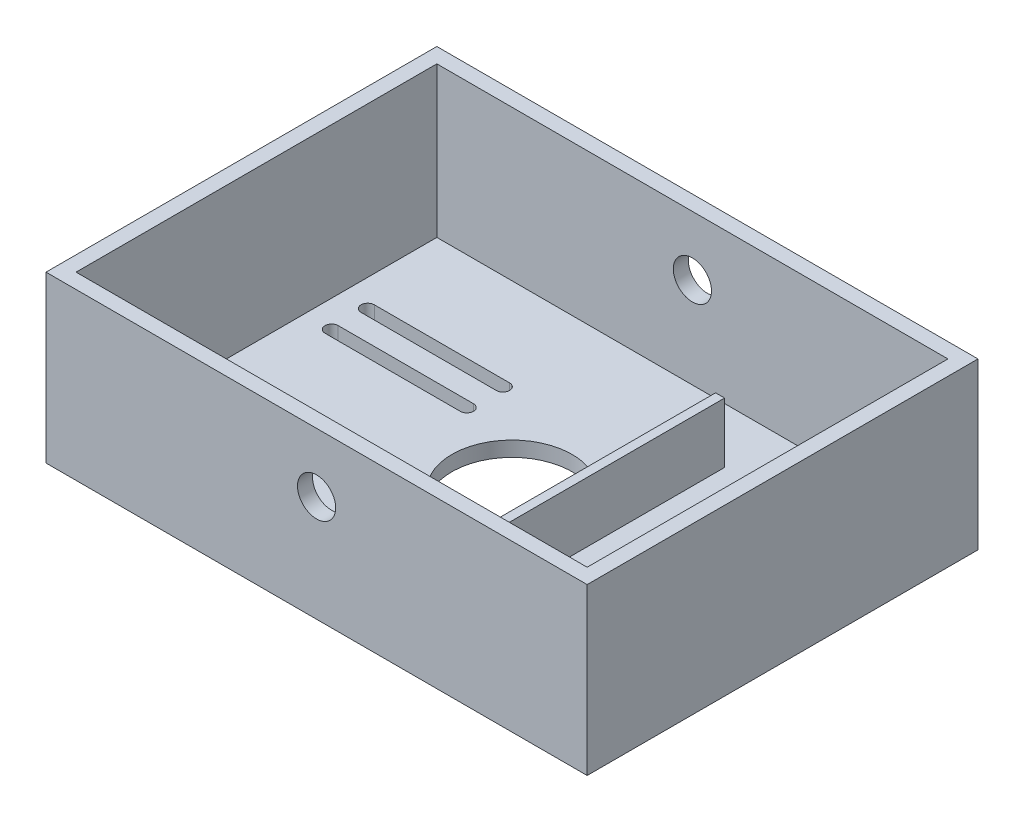
ISO-10303-21;
HEADER;
FILE_DESCRIPTION(('STEP AP214'),'2;1');
FILE_NAME('part.step','',(''),(''),'','','');
FILE_SCHEMA(('AUTOMOTIVE_DESIGN { 1 0 10303 214 1 1 1 1 }'));
ENDSEC;
DATA;
#1=APPLICATION_CONTEXT('core data for automotive mechanical design processes');
#2=APPLICATION_PROTOCOL_DEFINITION('international standard','automotive_design',2000,#1);
#3=PRODUCT_CONTEXT('',#1,'mechanical');
#4=PRODUCT('Part','Part','',(#3));
#5=PRODUCT_RELATED_PRODUCT_CATEGORY('part','',(#4));
#6=PRODUCT_DEFINITION_FORMATION('','',#4);
#7=PRODUCT_DEFINITION_CONTEXT('part definition',#1,'design');
#8=PRODUCT_DEFINITION('design','',#6,#7);
#9=PRODUCT_DEFINITION_SHAPE('','',#8);
#10=(LENGTH_UNIT() NAMED_UNIT(*) SI_UNIT(.MILLI.,.METRE.));
#11=(NAMED_UNIT(*) PLANE_ANGLE_UNIT() SI_UNIT($,.RADIAN.));
#12=(NAMED_UNIT(*) SI_UNIT($,.STERADIAN.) SOLID_ANGLE_UNIT());
#13=UNCERTAINTY_MEASURE_WITH_UNIT(LENGTH_MEASURE(1.E-05),#10,'distance_accuracy_value','');
#14=(GEOMETRIC_REPRESENTATION_CONTEXT(3) GLOBAL_UNCERTAINTY_ASSIGNED_CONTEXT((#13)) GLOBAL_UNIT_ASSIGNED_CONTEXT((#10,
#11,#12)) REPRESENTATION_CONTEXT('',''));
#15=CARTESIAN_POINT('',(0.,0.,0.));
#16=DIRECTION('',(0.,0.,1.));
#17=DIRECTION('',(1.,0.,0.));
#18=AXIS2_PLACEMENT_3D('',#15,#16,#17);
#19=CARTESIAN_POINT('',(85.,55.,60.));
#20=DIRECTION('',(0.,0.,-1.));
#21=DIRECTION('',(-1.,0.,0.));
#22=AXIS2_PLACEMENT_3D('',#19,#20,#21);
#23=PLANE('',#22);
#24=CARTESIAN_POINT('',(0.,35.25,60.));
#25=DIRECTION('',(0.,0.,-1.));
#26=DIRECTION('',(-1.,0.,0.));
#27=AXIS2_PLACEMENT_3D('',#24,#25,#26);
#28=CIRCLE('',#27,6.35);
#29=CARTESIAN_POINT('',(-6.35000000000001,35.25,60.));
#30=VERTEX_POINT('',#29);
#31=EDGE_CURVE('E233',#30,#30,#28,.T.);
#32=ORIENTED_EDGE('',*,*,#31,.F.);
#33=EDGE_LOOP('',(#32));
#34=FACE_BOUND('',#33,.T.);
#35=DIRECTION('',(1.,0.,0.));
#36=VECTOR('',#35,1.);
#37=CARTESIAN_POINT('',(26.12,25.,60.));
#38=LINE('',#37,#36);
#39=CARTESIAN_POINT('',(26.12,25.,60.));
#40=VERTEX_POINT('',#39);
#41=CARTESIAN_POINT('',(29.12,25.,60.));
#42=VERTEX_POINT('',#41);
#43=EDGE_CURVE('E182',#40,#42,#38,.T.);
#44=ORIENTED_EDGE('',*,*,#43,.F.);
#45=DIRECTION('',(0.,-1.,0.));
#46=VECTOR('',#45,1.);
#47=CARTESIAN_POINT('',(26.12,25.,60.));
#48=LINE('',#47,#46);
#49=CARTESIAN_POINT('',(26.12,5.,60.));
#50=VERTEX_POINT('',#49);
#51=EDGE_CURVE('E192',#40,#50,#48,.T.);
#52=ORIENTED_EDGE('',*,*,#51,.T.);
#53=DIRECTION('',(1.,0.,0.));
#54=VECTOR('',#53,1.);
#55=CARTESIAN_POINT('',(-85.,5.,60.));
#56=LINE('',#55,#54);
#57=CARTESIAN_POINT('',(-85.,5.,60.));
#58=VERTEX_POINT('',#57);
#59=EDGE_CURVE('E336',#58,#50,#56,.T.);
#60=ORIENTED_EDGE('',*,*,#59,.F.);
#61=DIRECTION('',(0.,-1.,0.));
#62=VECTOR('',#61,1.);
#63=CARTESIAN_POINT('',(-85.,55.,60.));
#64=LINE('',#63,#62);
#65=CARTESIAN_POINT('',(-85.,55.,60.));
#66=VERTEX_POINT('',#65);
#67=EDGE_CURVE('E371',#66,#58,#64,.T.);
#68=ORIENTED_EDGE('',*,*,#67,.F.);
#69=DIRECTION('',(1.,0.,0.));
#70=VECTOR('',#69,1.);
#71=CARTESIAN_POINT('',(85.,55.,60.));
#72=LINE('',#71,#70);
#73=CARTESIAN_POINT('',(85.,55.,60.));
#74=VERTEX_POINT('',#73);
#75=EDGE_CURVE('E350',#66,#74,#72,.T.);
#76=ORIENTED_EDGE('',*,*,#75,.T.);
#77=DIRECTION('',(0.,-1.,0.));
#78=VECTOR('',#77,1.);
#79=CARTESIAN_POINT('',(85.,55.,60.));
#80=LINE('',#79,#78);
#81=CARTESIAN_POINT('',(85.,5.,60.));
#82=VERTEX_POINT('',#81);
#83=EDGE_CURVE('E367',#74,#82,#80,.T.);
#84=ORIENTED_EDGE('',*,*,#83,.T.);
#85=CARTESIAN_POINT('',(29.12,5.,60.));
#86=VERTEX_POINT('',#85);
#87=EDGE_CURVE('E335',#86,#82,#56,.T.);
#88=ORIENTED_EDGE('',*,*,#87,.F.);
#89=DIRECTION('',(0.,-1.,0.));
#90=VECTOR('',#89,1.);
#91=CARTESIAN_POINT('',(29.12,25.,60.));
#92=LINE('',#91,#90);
#93=EDGE_CURVE('E200',#42,#86,#92,.T.);
#94=ORIENTED_EDGE('',*,*,#93,.F.);
#95=EDGE_LOOP('',(#44,#52,#60,#68,#76,#84,#88,#94));
#96=FACE_BOUND('',#95,.T.);
#97=ADVANCED_FACE('F39',(#34,#96),#23,.T.);
#98=CARTESIAN_POINT('',(0.,5.,0.));
#99=DIRECTION('',(0.,1.,0.));
#100=DIRECTION('',(0.,0.,1.));
#101=AXIS2_PLACEMENT_3D('',#98,#99,#100);
#102=PLANE('',#101);
#103=CARTESIAN_POINT('',(-76.,5.,-28.));
#104=DIRECTION('',(0.,1.,0.));
#105=DIRECTION('',(0.,0.,1.));
#106=AXIS2_PLACEMENT_3D('',#103,#104,#105);
#107=CIRCLE('',#106,2.2);
#108=CARTESIAN_POINT('',(-76.,5.,-30.2));
#109=VERTEX_POINT('',#108);
#110=CARTESIAN_POINT('',(-76.,5.,-25.8));
#111=VERTEX_POINT('',#110);
#112=EDGE_CURVE('E254',#109,#111,#107,.T.);
#113=ORIENTED_EDGE('',*,*,#112,.F.);
#114=DIRECTION('',(-1.,0.,0.));
#115=VECTOR('',#114,1.);
#116=CARTESIAN_POINT('',(-76.,5.,-30.2));
#117=LINE('',#116,#115);
#118=CARTESIAN_POINT('',(-31.,5.,-30.2));
#119=VERTEX_POINT('',#118);
#120=EDGE_CURVE('E243',#119,#109,#117,.T.);
#121=ORIENTED_EDGE('',*,*,#120,.F.);
#122=CARTESIAN_POINT('',(-31.,5.,-28.));
#123=DIRECTION('',(0.,1.,0.));
#124=DIRECTION('',(0.,0.,1.));
#125=AXIS2_PLACEMENT_3D('',#122,#123,#124);
#126=CIRCLE('',#125,2.2);
#127=CARTESIAN_POINT('',(-31.,5.,-25.8));
#128=VERTEX_POINT('',#127);
#129=EDGE_CURVE('E262',#128,#119,#126,.T.);
#130=ORIENTED_EDGE('',*,*,#129,.F.);
#131=DIRECTION('',(1.,0.,0.));
#132=VECTOR('',#131,1.);
#133=CARTESIAN_POINT('',(-76.,5.,-25.8));
#134=LINE('',#133,#132);
#135=EDGE_CURVE('E257',#111,#128,#134,.T.);
#136=ORIENTED_EDGE('',*,*,#135,.F.);
#137=EDGE_LOOP('',(#113,#121,#130,#136));
#138=FACE_BOUND('',#137,.T.);
#139=CARTESIAN_POINT('',(-76.,5.,-16.));
#140=DIRECTION('',(0.,1.,0.));
#141=DIRECTION('',(0.,0.,1.));
#142=AXIS2_PLACEMENT_3D('',#139,#140,#141);
#143=CIRCLE('',#142,2.2);
#144=CARTESIAN_POINT('',(-76.,5.,-18.2));
#145=VERTEX_POINT('',#144);
#146=CARTESIAN_POINT('',(-76.,5.,-13.8));
#147=VERTEX_POINT('',#146);
#148=EDGE_CURVE('E237',#145,#147,#143,.T.);
#149=ORIENTED_EDGE('',*,*,#148,.F.);
#150=DIRECTION('',(-1.,0.,0.));
#151=VECTOR('',#150,1.);
#152=CARTESIAN_POINT('',(-76.,5.,-18.2));
#153=LINE('',#152,#151);
#154=CARTESIAN_POINT('',(-31.,5.,-18.2));
#155=VERTEX_POINT('',#154);
#156=EDGE_CURVE('E287',#155,#145,#153,.T.);
#157=ORIENTED_EDGE('',*,*,#156,.F.);
#158=CARTESIAN_POINT('',(-31.,5.,-16.));
#159=DIRECTION('',(0.,1.,0.));
#160=DIRECTION('',(0.,0.,1.));
#161=AXIS2_PLACEMENT_3D('',#158,#159,#160);
#162=CIRCLE('',#161,2.2);
#163=CARTESIAN_POINT('',(-31.,5.,-13.8));
#164=VERTEX_POINT('',#163);
#165=EDGE_CURVE('E306',#164,#155,#162,.T.);
#166=ORIENTED_EDGE('',*,*,#165,.F.);
#167=DIRECTION('',(1.,0.,0.));
#168=VECTOR('',#167,1.);
#169=CARTESIAN_POINT('',(-76.,5.,-13.8));
#170=LINE('',#169,#168);
#171=EDGE_CURVE('E302',#147,#164,#170,.T.);
#172=ORIENTED_EDGE('',*,*,#171,.F.);
#173=EDGE_LOOP('',(#149,#157,#166,#172));
#174=FACE_BOUND('',#173,.T.);
#175=CARTESIAN_POINT('',(0.,5.,0.));
#176=DIRECTION('',(0.,1.,0.));
#177=DIRECTION('',(0.,0.,1.));
#178=AXIS2_PLACEMENT_3D('',#175,#176,#177);
#179=CIRCLE('',#178,20.);
#180=CARTESIAN_POINT('',(0.,5.,20.));
#181=VERTEX_POINT('',#180);
#182=EDGE_CURVE('E272',#181,#181,#179,.T.);
#183=ORIENTED_EDGE('',*,*,#182,.F.);
#184=EDGE_LOOP('',(#183));
#185=FACE_BOUND('',#184,.T.);
#186=ORIENTED_EDGE('',*,*,#59,.T.);
#187=DIRECTION('',(0.,0.,1.));
#188=VECTOR('',#187,1.);
#189=CARTESIAN_POINT('',(26.12,5.,-41.6));
#190=LINE('',#189,#188);
#191=CARTESIAN_POINT('',(26.12,5.,-41.6));
#192=VERTEX_POINT('',#191);
#193=EDGE_CURVE('E195',#192,#50,#190,.T.);
#194=ORIENTED_EDGE('',*,*,#193,.F.);
#195=DIRECTION('',(-1.,0.,0.));
#196=VECTOR('',#195,1.);
#197=CARTESIAN_POINT('',(26.12,5.,-41.6));
#198=LINE('',#197,#196);
#199=CARTESIAN_POINT('',(29.12,5.,-41.6));
#200=VERTEX_POINT('',#199);
#201=EDGE_CURVE('E189',#200,#192,#198,.T.);
#202=ORIENTED_EDGE('',*,*,#201,.F.);
#203=DIRECTION('',(0.,0.,-1.));
#204=VECTOR('',#203,1.);
#205=CARTESIAN_POINT('',(29.12,5.,-41.6));
#206=LINE('',#205,#204);
#207=EDGE_CURVE('E215',#86,#200,#206,.T.);
#208=ORIENTED_EDGE('',*,*,#207,.F.);
#209=ORIENTED_EDGE('',*,*,#87,.T.);
#210=DIRECTION('',(0.,0.,-1.));
#211=VECTOR('',#210,1.);
#212=CARTESIAN_POINT('',(85.,5.,-60.));
#213=LINE('',#212,#211);
#214=CARTESIAN_POINT('',(85.,5.,-60.));
#215=VERTEX_POINT('',#214);
#216=EDGE_CURVE('E339',#82,#215,#213,.T.);
#217=ORIENTED_EDGE('',*,*,#216,.T.);
#218=DIRECTION('',(-1.,0.,0.));
#219=VECTOR('',#218,1.);
#220=CARTESIAN_POINT('',(-85.,5.,-60.));
#221=LINE('',#220,#219);
#222=CARTESIAN_POINT('',(-85.,5.,-60.));
#223=VERTEX_POINT('',#222);
#224=EDGE_CURVE('E343',#215,#223,#221,.T.);
#225=ORIENTED_EDGE('',*,*,#224,.T.);
#226=DIRECTION('',(0.,0.,1.));
#227=VECTOR('',#226,1.);
#228=CARTESIAN_POINT('',(-85.,5.,-60.));
#229=LINE('',#228,#227);
#230=EDGE_CURVE('E328',#223,#58,#229,.T.);
#231=ORIENTED_EDGE('',*,*,#230,.T.);
#232=EDGE_LOOP('',(#186,#194,#202,#208,#209,#217,#225,#231));
#233=FACE_BOUND('',#232,.T.);
#234=ADVANCED_FACE('F442',(#138,#174,#185,#233),#102,.T.);
#235=CARTESIAN_POINT('',(0.,55.,0.));
#236=DIRECTION('',(0.,-1.,0.));
#237=DIRECTION('',(0.,0.,-1.));
#238=AXIS2_PLACEMENT_3D('',#235,#236,#237);
#239=PLANE('',#238);
#240=DIRECTION('',(0.,0.,-1.));
#241=VECTOR('',#240,1.);
#242=CARTESIAN_POINT('',(90.,55.,65.));
#243=LINE('',#242,#241);
#244=CARTESIAN_POINT('',(90.,55.,65.));
#245=VERTEX_POINT('',#244);
#246=CARTESIAN_POINT('',(90.,55.,-65.));
#247=VERTEX_POINT('',#246);
#248=EDGE_CURVE('E376',#245,#247,#243,.T.);
#249=ORIENTED_EDGE('',*,*,#248,.T.);
#250=DIRECTION('',(-1.,0.,0.));
#251=VECTOR('',#250,1.);
#252=CARTESIAN_POINT('',(-90.,55.,-65.));
#253=LINE('',#252,#251);
#254=CARTESIAN_POINT('',(-90.,55.,-65.));
#255=VERTEX_POINT('',#254);
#256=EDGE_CURVE('E380',#247,#255,#253,.T.);
#257=ORIENTED_EDGE('',*,*,#256,.T.);
#258=DIRECTION('',(0.,0.,1.));
#259=VECTOR('',#258,1.);
#260=CARTESIAN_POINT('',(-90.,55.,65.));
#261=LINE('',#260,#259);
#262=CARTESIAN_POINT('',(-90.,55.,65.));
#263=VERTEX_POINT('',#262);
#264=EDGE_CURVE('E384',#255,#263,#261,.T.);
#265=ORIENTED_EDGE('',*,*,#264,.T.);
#266=DIRECTION('',(1.,0.,0.));
#267=VECTOR('',#266,1.);
#268=CARTESIAN_POINT('',(-90.,55.,65.));
#269=LINE('',#268,#267);
#270=EDGE_CURVE('E387',#263,#245,#269,.T.);
#271=ORIENTED_EDGE('',*,*,#270,.T.);
#272=EDGE_LOOP('',(#249,#257,#265,#271));
#273=FACE_BOUND('',#272,.T.);
#274=DIRECTION('',(0.,0.,1.));
#275=VECTOR('',#274,1.);
#276=CARTESIAN_POINT('',(-85.,55.,60.));
#277=LINE('',#276,#275);
#278=CARTESIAN_POINT('',(-85.,55.,-60.));
#279=VERTEX_POINT('',#278);
#280=EDGE_CURVE('E347',#279,#66,#277,.T.);
#281=ORIENTED_EDGE('',*,*,#280,.F.);
#282=DIRECTION('',(-1.,0.,0.));
#283=VECTOR('',#282,1.);
#284=CARTESIAN_POINT('',(85.,55.,-60.));
#285=LINE('',#284,#283);
#286=CARTESIAN_POINT('',(85.,55.,-60.));
#287=VERTEX_POINT('',#286);
#288=EDGE_CURVE('E357',#287,#279,#285,.T.);
#289=ORIENTED_EDGE('',*,*,#288,.F.);
#290=DIRECTION('',(0.,0.,-1.));
#291=VECTOR('',#290,1.);
#292=CARTESIAN_POINT('',(85.,55.,60.));
#293=LINE('',#292,#291);
#294=EDGE_CURVE('E353',#74,#287,#293,.T.);
#295=ORIENTED_EDGE('',*,*,#294,.F.);
#296=ORIENTED_EDGE('',*,*,#75,.F.);
#297=EDGE_LOOP('',(#281,#289,#295,#296));
#298=FACE_BOUND('',#297,.T.);
#299=ADVANCED_FACE('F430',(#273,#298),#239,.F.);
#300=CARTESIAN_POINT('',(0.,0.,0.));
#301=DIRECTION('',(0.,-1.,0.));
#302=DIRECTION('',(0.,0.,-1.));
#303=AXIS2_PLACEMENT_3D('',#300,#301,#302);
#304=PLANE('',#303);
#305=CARTESIAN_POINT('',(-76.,0.,-28.));
#306=DIRECTION('',(0.,1.,0.));
#307=DIRECTION('',(0.,0.,1.));
#308=AXIS2_PLACEMENT_3D('',#305,#306,#307);
#309=CIRCLE('',#308,2.2);
#310=CARTESIAN_POINT('',(-76.,0.,-30.2));
#311=VERTEX_POINT('',#310);
#312=CARTESIAN_POINT('',(-76.,0.,-25.8));
#313=VERTEX_POINT('',#312);
#314=EDGE_CURVE('E238',#311,#313,#309,.T.);
#315=ORIENTED_EDGE('',*,*,#314,.T.);
#316=DIRECTION('',(1.,0.,0.));
#317=VECTOR('',#316,1.);
#318=CARTESIAN_POINT('',(-76.,0.,-25.8));
#319=LINE('',#318,#317);
#320=CARTESIAN_POINT('',(-31.,0.,-25.8));
#321=VERTEX_POINT('',#320);
#322=EDGE_CURVE('E242',#313,#321,#319,.T.);
#323=ORIENTED_EDGE('',*,*,#322,.T.);
#324=CARTESIAN_POINT('',(-31.,0.,-28.));
#325=DIRECTION('',(0.,1.,0.));
#326=DIRECTION('',(0.,0.,1.));
#327=AXIS2_PLACEMENT_3D('',#324,#325,#326);
#328=CIRCLE('',#327,2.2);
#329=CARTESIAN_POINT('',(-31.,0.,-30.2));
#330=VERTEX_POINT('',#329);
#331=EDGE_CURVE('E64',#321,#330,#328,.T.);
#332=ORIENTED_EDGE('',*,*,#331,.T.);
#333=DIRECTION('',(-1.,0.,0.));
#334=VECTOR('',#333,1.);
#335=CARTESIAN_POINT('',(-76.,0.,-30.2));
#336=LINE('',#335,#334);
#337=EDGE_CURVE('E249',#330,#311,#336,.T.);
#338=ORIENTED_EDGE('',*,*,#337,.T.);
#339=EDGE_LOOP('',(#315,#323,#332,#338));
#340=FACE_BOUND('',#339,.T.);
#341=CARTESIAN_POINT('',(-76.,0.,-16.));
#342=DIRECTION('',(0.,1.,0.));
#343=DIRECTION('',(0.,0.,1.));
#344=AXIS2_PLACEMENT_3D('',#341,#342,#343);
#345=CIRCLE('',#344,2.2);
#346=CARTESIAN_POINT('',(-76.,0.,-18.2));
#347=VERTEX_POINT('',#346);
#348=CARTESIAN_POINT('',(-76.,0.,-13.8));
#349=VERTEX_POINT('',#348);
#350=EDGE_CURVE('E282',#347,#349,#345,.T.);
#351=ORIENTED_EDGE('',*,*,#350,.T.);
#352=DIRECTION('',(1.,0.,0.));
#353=VECTOR('',#352,1.);
#354=CARTESIAN_POINT('',(-76.,0.,-13.8));
#355=LINE('',#354,#353);
#356=CARTESIAN_POINT('',(-31.,0.,-13.8));
#357=VERTEX_POINT('',#356);
#358=EDGE_CURVE('E286',#349,#357,#355,.T.);
#359=ORIENTED_EDGE('',*,*,#358,.T.);
#360=CARTESIAN_POINT('',(-31.,0.,-16.));
#361=DIRECTION('',(0.,1.,0.));
#362=DIRECTION('',(0.,0.,1.));
#363=AXIS2_PLACEMENT_3D('',#360,#361,#362);
#364=CIRCLE('',#363,2.2);
#365=CARTESIAN_POINT('',(-31.,0.,-18.2));
#366=VERTEX_POINT('',#365);
#367=EDGE_CURVE('E291',#357,#366,#364,.T.);
#368=ORIENTED_EDGE('',*,*,#367,.T.);
#369=DIRECTION('',(-1.,0.,0.));
#370=VECTOR('',#369,1.);
#371=CARTESIAN_POINT('',(-76.,0.,-18.2));
#372=LINE('',#371,#370);
#373=EDGE_CURVE('E295',#366,#347,#372,.T.);
#374=ORIENTED_EDGE('',*,*,#373,.T.);
#375=EDGE_LOOP('',(#351,#359,#368,#374));
#376=FACE_BOUND('',#375,.T.);
#377=CARTESIAN_POINT('',(0.,0.,0.));
#378=DIRECTION('',(0.,1.,0.));
#379=DIRECTION('',(0.,0.,1.));
#380=AXIS2_PLACEMENT_3D('',#377,#378,#379);
#381=CIRCLE('',#380,20.);
#382=CARTESIAN_POINT('',(0.,0.,20.));
#383=VERTEX_POINT('',#382);
#384=EDGE_CURVE('E324',#383,#383,#381,.T.);
#385=ORIENTED_EDGE('',*,*,#384,.T.);
#386=EDGE_LOOP('',(#385));
#387=FACE_BOUND('',#386,.T.);
#388=DIRECTION('',(0.,0.,-1.));
#389=VECTOR('',#388,1.);
#390=CARTESIAN_POINT('',(90.,0.,65.));
#391=LINE('',#390,#389);
#392=CARTESIAN_POINT('',(90.,0.,65.));
#393=VERTEX_POINT('',#392);
#394=CARTESIAN_POINT('',(90.,0.,-65.));
#395=VERTEX_POINT('',#394);
#396=EDGE_CURVE('E375',#393,#395,#391,.T.);
#397=ORIENTED_EDGE('',*,*,#396,.F.);
#398=DIRECTION('',(1.,0.,0.));
#399=VECTOR('',#398,1.);
#400=CARTESIAN_POINT('',(-90.,0.,65.));
#401=LINE('',#400,#399);
#402=CARTESIAN_POINT('',(-90.,0.,65.));
#403=VERTEX_POINT('',#402);
#404=EDGE_CURVE('E381',#403,#393,#401,.T.);
#405=ORIENTED_EDGE('',*,*,#404,.F.);
#406=DIRECTION('',(0.,0.,1.));
#407=VECTOR('',#406,1.);
#408=CARTESIAN_POINT('',(-90.,0.,65.));
#409=LINE('',#408,#407);
#410=CARTESIAN_POINT('',(-90.,0.,-65.));
#411=VERTEX_POINT('',#410);
#412=EDGE_CURVE('E397',#411,#403,#409,.T.);
#413=ORIENTED_EDGE('',*,*,#412,.F.);
#414=DIRECTION('',(-1.,0.,0.));
#415=VECTOR('',#414,1.);
#416=CARTESIAN_POINT('',(-90.,0.,-65.));
#417=LINE('',#416,#415);
#418=EDGE_CURVE('E394',#395,#411,#417,.T.);
#419=ORIENTED_EDGE('',*,*,#418,.F.);
#420=EDGE_LOOP('',(#397,#405,#413,#419));
#421=FACE_BOUND('',#420,.T.);
#422=ADVANCED_FACE('F421',(#340,#376,#387,#421),#304,.T.);
#423=CARTESIAN_POINT('',(90.,55.,65.));
#424=DIRECTION('',(-1.,0.,0.));
#425=DIRECTION('',(0.,0.,1.));
#426=AXIS2_PLACEMENT_3D('',#423,#424,#425);
#427=PLANE('',#426);
#428=ORIENTED_EDGE('',*,*,#396,.T.);
#429=DIRECTION('',(0.,-1.,0.));
#430=VECTOR('',#429,1.);
#431=CARTESIAN_POINT('',(90.,55.,-65.));
#432=LINE('',#431,#430);
#433=EDGE_CURVE('E11',#247,#395,#432,.T.);
#434=ORIENTED_EDGE('',*,*,#433,.F.);
#435=ORIENTED_EDGE('',*,*,#248,.F.);
#436=DIRECTION('',(0.,-1.,0.));
#437=VECTOR('',#436,1.);
#438=CARTESIAN_POINT('',(90.,55.,65.));
#439=LINE('',#438,#437);
#440=EDGE_CURVE('E390',#245,#393,#439,.T.);
#441=ORIENTED_EDGE('',*,*,#440,.T.);
#442=EDGE_LOOP('',(#428,#434,#435,#441));
#443=FACE_BOUND('',#442,.T.);
#444=ADVANCED_FACE('F41',(#443),#427,.F.);
#445=CARTESIAN_POINT('',(-90.,55.,-65.));
#446=DIRECTION('',(0.,0.,1.));
#447=DIRECTION('',(1.,0.,0.));
#448=AXIS2_PLACEMENT_3D('',#445,#446,#447);
#449=PLANE('',#448);
#450=CARTESIAN_POINT('',(0.,35.25,-65.));
#451=DIRECTION('',(0.,0.,-1.));
#452=DIRECTION('',(-1.,0.,0.));
#453=AXIS2_PLACEMENT_3D('',#450,#451,#452);
#454=CIRCLE('',#453,6.35);
#455=CARTESIAN_POINT('',(-6.35000000000001,35.25,-65.));
#456=VERTEX_POINT('',#455);
#457=EDGE_CURVE('E199',#456,#456,#454,.T.);
#458=ORIENTED_EDGE('',*,*,#457,.F.);
#459=EDGE_LOOP('',(#458));
#460=FACE_BOUND('',#459,.T.);
#461=ORIENTED_EDGE('',*,*,#418,.T.);
#462=DIRECTION('',(0.,-1.,0.));
#463=VECTOR('',#462,1.);
#464=CARTESIAN_POINT('',(-90.,55.,-65.));
#465=LINE('',#464,#463);
#466=EDGE_CURVE('E49',#255,#411,#465,.T.);
#467=ORIENTED_EDGE('',*,*,#466,.F.);
#468=ORIENTED_EDGE('',*,*,#256,.F.);
#469=ORIENTED_EDGE('',*,*,#433,.T.);
#470=EDGE_LOOP('',(#461,#467,#468,#469));
#471=FACE_BOUND('',#470,.T.);
#472=ADVANCED_FACE('F432',(#460,#471),#449,.F.);
#473=CARTESIAN_POINT('',(-90.,55.,65.));
#474=DIRECTION('',(1.,0.,0.));
#475=DIRECTION('',(0.,0.,-1.));
#476=AXIS2_PLACEMENT_3D('',#473,#474,#475);
#477=PLANE('',#476);
#478=ORIENTED_EDGE('',*,*,#412,.T.);
#479=DIRECTION('',(0.,-1.,0.));
#480=VECTOR('',#479,1.);
#481=CARTESIAN_POINT('',(-90.,55.,65.));
#482=LINE('',#481,#480);
#483=EDGE_CURVE('E405',#263,#403,#482,.T.);
#484=ORIENTED_EDGE('',*,*,#483,.F.);
#485=ORIENTED_EDGE('',*,*,#264,.F.);
#486=ORIENTED_EDGE('',*,*,#466,.T.);
#487=EDGE_LOOP('',(#478,#484,#485,#486));
#488=FACE_BOUND('',#487,.T.);
#489=ADVANCED_FACE('F415',(#488),#477,.F.);
#490=CARTESIAN_POINT('',(-90.,55.,65.));
#491=DIRECTION('',(0.,0.,-1.));
#492=DIRECTION('',(-1.,0.,0.));
#493=AXIS2_PLACEMENT_3D('',#490,#491,#492);
#494=PLANE('',#493);
#495=CARTESIAN_POINT('',(0.,35.25,65.));
#496=DIRECTION('',(0.,0.,-1.));
#497=DIRECTION('',(-1.,0.,0.));
#498=AXIS2_PLACEMENT_3D('',#495,#496,#497);
#499=CIRCLE('',#498,6.35);
#500=CARTESIAN_POINT('',(-6.35000000000001,35.25,65.));
#501=VERTEX_POINT('',#500);
#502=EDGE_CURVE('E229',#501,#501,#499,.F.);
#503=ORIENTED_EDGE('',*,*,#502,.F.);
#504=EDGE_LOOP('',(#503));
#505=FACE_BOUND('',#504,.T.);
#506=ORIENTED_EDGE('',*,*,#404,.T.);
#507=ORIENTED_EDGE('',*,*,#440,.F.);
#508=ORIENTED_EDGE('',*,*,#270,.F.);
#509=ORIENTED_EDGE('',*,*,#483,.T.);
#510=EDGE_LOOP('',(#506,#507,#508,#509));
#511=FACE_BOUND('',#510,.T.);
#512=ADVANCED_FACE('F424',(#505,#511),#494,.F.);
#513=CARTESIAN_POINT('',(-85.,55.,60.));
#514=DIRECTION('',(1.,0.,0.));
#515=DIRECTION('',(0.,0.,-1.));
#516=AXIS2_PLACEMENT_3D('',#513,#514,#515);
#517=PLANE('',#516);
#518=ORIENTED_EDGE('',*,*,#230,.F.);
#519=DIRECTION('',(0.,-1.,0.));
#520=VECTOR('',#519,1.);
#521=CARTESIAN_POINT('',(-85.,55.,-60.));
#522=LINE('',#521,#520);
#523=EDGE_CURVE('E360',#279,#223,#522,.T.);
#524=ORIENTED_EDGE('',*,*,#523,.F.);
#525=ORIENTED_EDGE('',*,*,#280,.T.);
#526=ORIENTED_EDGE('',*,*,#67,.T.);
#527=EDGE_LOOP('',(#518,#524,#525,#526));
#528=FACE_BOUND('',#527,.T.);
#529=ADVANCED_FACE('F455',(#528),#517,.T.);
#530=CARTESIAN_POINT('',(85.,55.,60.));
#531=DIRECTION('',(-1.,0.,0.));
#532=DIRECTION('',(0.,0.,1.));
#533=AXIS2_PLACEMENT_3D('',#530,#531,#532);
#534=PLANE('',#533);
#535=ORIENTED_EDGE('',*,*,#216,.F.);
#536=ORIENTED_EDGE('',*,*,#83,.F.);
#537=ORIENTED_EDGE('',*,*,#294,.T.);
#538=DIRECTION('',(0.,-1.,0.));
#539=VECTOR('',#538,1.);
#540=CARTESIAN_POINT('',(85.,55.,-60.));
#541=LINE('',#540,#539);
#542=EDGE_CURVE('E363',#287,#215,#541,.T.);
#543=ORIENTED_EDGE('',*,*,#542,.T.);
#544=EDGE_LOOP('',(#535,#536,#537,#543));
#545=FACE_BOUND('',#544,.T.);
#546=ADVANCED_FACE('F453',(#545),#534,.T.);
#547=CARTESIAN_POINT('',(85.,55.,-60.));
#548=DIRECTION('',(0.,0.,1.));
#549=DIRECTION('',(1.,0.,0.));
#550=AXIS2_PLACEMENT_3D('',#547,#548,#549);
#551=PLANE('',#550);
#552=CARTESIAN_POINT('',(0.,35.25,-60.));
#553=DIRECTION('',(0.,0.,1.));
#554=DIRECTION('',(1.,0.,0.));
#555=AXIS2_PLACEMENT_3D('',#552,#553,#554);
#556=CIRCLE('',#555,6.35);
#557=CARTESIAN_POINT('',(6.34999999999999,35.25,-60.));
#558=VERTEX_POINT('',#557);
#559=EDGE_CURVE('E43',#558,#558,#556,.T.);
#560=ORIENTED_EDGE('',*,*,#559,.F.);
#561=EDGE_LOOP('',(#560));
#562=FACE_BOUND('',#561,.T.);
#563=ORIENTED_EDGE('',*,*,#224,.F.);
#564=ORIENTED_EDGE('',*,*,#542,.F.);
#565=ORIENTED_EDGE('',*,*,#288,.T.);
#566=ORIENTED_EDGE('',*,*,#523,.T.);
#567=EDGE_LOOP('',(#563,#564,#565,#566));
#568=FACE_BOUND('',#567,.T.);
#569=ADVANCED_FACE('F517',(#562,#568),#551,.T.);
#570=CARTESIAN_POINT('',(0.,0.,0.));
#571=DIRECTION('',(0.,1.,0.));
#572=DIRECTION('',(0.,0.,1.));
#573=AXIS2_PLACEMENT_3D('',#570,#571,#572);
#574=CYLINDRICAL_SURFACE('',#573,20.);
#575=ORIENTED_EDGE('',*,*,#384,.F.);
#576=EDGE_LOOP('',(#575));
#577=FACE_BOUND('',#576,.T.);
#578=ORIENTED_EDGE('',*,*,#182,.T.);
#579=EDGE_LOOP('',(#578));
#580=FACE_BOUND('',#579,.T.);
#581=ADVANCED_FACE('F514',(#577,#580),#574,.F.);
#582=CARTESIAN_POINT('',(-76.,0.,-16.));
#583=DIRECTION('',(0.,1.,0.));
#584=DIRECTION('',(0.,0.,1.));
#585=AXIS2_PLACEMENT_3D('',#582,#583,#584);
#586=CYLINDRICAL_SURFACE('',#585,2.2);
#587=ORIENTED_EDGE('',*,*,#148,.T.);
#588=DIRECTION('',(0.,1.,0.));
#589=VECTOR('',#588,1.);
#590=CARTESIAN_POINT('',(-76.,0.,-13.8));
#591=LINE('',#590,#589);
#592=EDGE_CURVE('E299',#349,#147,#591,.T.);
#593=ORIENTED_EDGE('',*,*,#592,.F.);
#594=ORIENTED_EDGE('',*,*,#350,.F.);
#595=DIRECTION('',(0.,1.,0.));
#596=VECTOR('',#595,1.);
#597=CARTESIAN_POINT('',(-76.,0.,-18.2));
#598=LINE('',#597,#596);
#599=EDGE_CURVE('E258',#347,#145,#598,.T.);
#600=ORIENTED_EDGE('',*,*,#599,.T.);
#601=EDGE_LOOP('',(#587,#593,#594,#600));
#602=FACE_BOUND('',#601,.T.);
#603=ADVANCED_FACE('F504',(#602),#586,.F.);
#604=CARTESIAN_POINT('',(-76.,0.,-18.2));
#605=DIRECTION('',(0.,0.,-1.));
#606=DIRECTION('',(-1.,0.,0.));
#607=AXIS2_PLACEMENT_3D('',#604,#605,#606);
#608=PLANE('',#607);
#609=ORIENTED_EDGE('',*,*,#156,.T.);
#610=ORIENTED_EDGE('',*,*,#599,.F.);
#611=ORIENTED_EDGE('',*,*,#373,.F.);
#612=DIRECTION('',(0.,1.,0.));
#613=VECTOR('',#612,1.);
#614=CARTESIAN_POINT('',(-31.,0.,-18.2));
#615=LINE('',#614,#613);
#616=EDGE_CURVE('E315',#366,#155,#615,.T.);
#617=ORIENTED_EDGE('',*,*,#616,.T.);
#618=EDGE_LOOP('',(#609,#610,#611,#617));
#619=FACE_BOUND('',#618,.T.);
#620=ADVANCED_FACE('F500',(#619),#608,.F.);
#621=CARTESIAN_POINT('',(-31.,0.,-16.));
#622=DIRECTION('',(0.,1.,0.));
#623=DIRECTION('',(0.,0.,1.));
#624=AXIS2_PLACEMENT_3D('',#621,#622,#623);
#625=CYLINDRICAL_SURFACE('',#624,2.2);
#626=ORIENTED_EDGE('',*,*,#165,.T.);
#627=ORIENTED_EDGE('',*,*,#616,.F.);
#628=ORIENTED_EDGE('',*,*,#367,.F.);
#629=DIRECTION('',(0.,1.,0.));
#630=VECTOR('',#629,1.);
#631=CARTESIAN_POINT('',(-31.,0.,-13.8));
#632=LINE('',#631,#630);
#633=EDGE_CURVE('E318',#357,#164,#632,.T.);
#634=ORIENTED_EDGE('',*,*,#633,.T.);
#635=EDGE_LOOP('',(#626,#627,#628,#634));
#636=FACE_BOUND('',#635,.T.);
#637=ADVANCED_FACE('F503',(#636),#625,.F.);
#638=CARTESIAN_POINT('',(-76.,0.,-13.8));
#639=DIRECTION('',(0.,0.,1.));
#640=DIRECTION('',(1.,0.,0.));
#641=AXIS2_PLACEMENT_3D('',#638,#639,#640);
#642=PLANE('',#641);
#643=ORIENTED_EDGE('',*,*,#171,.T.);
#644=ORIENTED_EDGE('',*,*,#633,.F.);
#645=ORIENTED_EDGE('',*,*,#358,.F.);
#646=ORIENTED_EDGE('',*,*,#592,.T.);
#647=EDGE_LOOP('',(#643,#644,#645,#646));
#648=FACE_BOUND('',#647,.T.);
#649=ADVANCED_FACE('F498',(#648),#642,.F.);
#650=CARTESIAN_POINT('',(-76.,0.,-28.));
#651=DIRECTION('',(0.,1.,0.));
#652=DIRECTION('',(0.,0.,1.));
#653=AXIS2_PLACEMENT_3D('',#650,#651,#652);
#654=CYLINDRICAL_SURFACE('',#653,2.2);
#655=ORIENTED_EDGE('',*,*,#112,.T.);
#656=DIRECTION('',(0.,1.,0.));
#657=VECTOR('',#656,1.);
#658=CARTESIAN_POINT('',(-76.,0.,-25.8));
#659=LINE('',#658,#657);
#660=EDGE_CURVE('E253',#313,#111,#659,.T.);
#661=ORIENTED_EDGE('',*,*,#660,.F.);
#662=ORIENTED_EDGE('',*,*,#314,.F.);
#663=DIRECTION('',(0.,1.,0.));
#664=VECTOR('',#663,1.);
#665=CARTESIAN_POINT('',(-76.,0.,-30.2));
#666=LINE('',#665,#664);
#667=EDGE_CURVE('E269',#311,#109,#666,.T.);
#668=ORIENTED_EDGE('',*,*,#667,.T.);
#669=EDGE_LOOP('',(#655,#661,#662,#668));
#670=FACE_BOUND('',#669,.T.);
#671=ADVANCED_FACE('F489',(#670),#654,.F.);
#672=CARTESIAN_POINT('',(-76.,0.,-30.2));
#673=DIRECTION('',(0.,0.,-1.));
#674=DIRECTION('',(-1.,0.,0.));
#675=AXIS2_PLACEMENT_3D('',#672,#673,#674);
#676=PLANE('',#675);
#677=ORIENTED_EDGE('',*,*,#120,.T.);
#678=ORIENTED_EDGE('',*,*,#667,.F.);
#679=ORIENTED_EDGE('',*,*,#337,.F.);
#680=DIRECTION('',(0.,1.,0.));
#681=VECTOR('',#680,1.);
#682=CARTESIAN_POINT('',(-31.,0.,-30.2));
#683=LINE('',#682,#681);
#684=EDGE_CURVE('E273',#330,#119,#683,.T.);
#685=ORIENTED_EDGE('',*,*,#684,.T.);
#686=EDGE_LOOP('',(#677,#678,#679,#685));
#687=FACE_BOUND('',#686,.T.);
#688=ADVANCED_FACE('F485',(#687),#676,.F.);
#689=CARTESIAN_POINT('',(-31.,0.,-28.));
#690=DIRECTION('',(0.,1.,0.));
#691=DIRECTION('',(0.,0.,1.));
#692=AXIS2_PLACEMENT_3D('',#689,#690,#691);
#693=CYLINDRICAL_SURFACE('',#692,2.2);
#694=ORIENTED_EDGE('',*,*,#129,.T.);
#695=ORIENTED_EDGE('',*,*,#684,.F.);
#696=ORIENTED_EDGE('',*,*,#331,.F.);
#697=DIRECTION('',(0.,1.,0.));
#698=VECTOR('',#697,1.);
#699=CARTESIAN_POINT('',(-31.,0.,-25.8));
#700=LINE('',#699,#698);
#701=EDGE_CURVE('E276',#321,#128,#700,.T.);
#702=ORIENTED_EDGE('',*,*,#701,.T.);
#703=EDGE_LOOP('',(#694,#695,#696,#702));
#704=FACE_BOUND('',#703,.T.);
#705=ADVANCED_FACE('F488',(#704),#693,.F.);
#706=CARTESIAN_POINT('',(-76.,0.,-25.8));
#707=DIRECTION('',(0.,0.,1.));
#708=DIRECTION('',(1.,0.,0.));
#709=AXIS2_PLACEMENT_3D('',#706,#707,#708);
#710=PLANE('',#709);
#711=ORIENTED_EDGE('',*,*,#135,.T.);
#712=ORIENTED_EDGE('',*,*,#701,.F.);
#713=ORIENTED_EDGE('',*,*,#322,.F.);
#714=ORIENTED_EDGE('',*,*,#660,.T.);
#715=EDGE_LOOP('',(#711,#712,#713,#714));
#716=FACE_BOUND('',#715,.T.);
#717=ADVANCED_FACE('F481',(#716),#710,.F.);
#718=CARTESIAN_POINT('',(0.,35.25,82.9605122421383));
#719=DIRECTION('',(0.,0.,-1.));
#720=DIRECTION('',(-1.,0.,0.));
#721=AXIS2_PLACEMENT_3D('',#718,#719,#720);
#722=CYLINDRICAL_SURFACE('',#721,6.35);
#723=ORIENTED_EDGE('',*,*,#559,.T.);
#724=EDGE_LOOP('',(#723));
#725=FACE_BOUND('',#724,.T.);
#726=ORIENTED_EDGE('',*,*,#457,.T.);
#727=EDGE_LOOP('',(#726));
#728=FACE_BOUND('',#727,.T.);
#729=ADVANCED_FACE('F472',(#725,#728),#722,.F.);
#730=ORIENTED_EDGE('',*,*,#31,.T.);
#731=EDGE_LOOP('',(#730));
#732=FACE_BOUND('',#731,.T.);
#733=ORIENTED_EDGE('',*,*,#502,.T.);
#734=EDGE_LOOP('',(#733));
#735=FACE_BOUND('',#734,.T.);
#736=ADVANCED_FACE('F470',(#732,#735),#722,.F.);
#737=CARTESIAN_POINT('',(26.12,25.,-41.6));
#738=DIRECTION('',(1.,0.,0.));
#739=DIRECTION('',(0.,0.,-1.));
#740=AXIS2_PLACEMENT_3D('',#737,#738,#739);
#741=PLANE('',#740);
#742=ORIENTED_EDGE('',*,*,#193,.T.);
#743=ORIENTED_EDGE('',*,*,#51,.F.);
#744=DIRECTION('',(0.,0.,1.));
#745=VECTOR('',#744,1.);
#746=CARTESIAN_POINT('',(26.12,25.,-41.6));
#747=LINE('',#746,#745);
#748=CARTESIAN_POINT('',(26.12,25.,-41.6));
#749=VERTEX_POINT('',#748);
#750=EDGE_CURVE('E178',#749,#40,#747,.T.);
#751=ORIENTED_EDGE('',*,*,#750,.F.);
#752=DIRECTION('',(0.,-1.,0.));
#753=VECTOR('',#752,1.);
#754=CARTESIAN_POINT('',(26.12,25.,-41.6));
#755=LINE('',#754,#753);
#756=EDGE_CURVE('E212',#749,#192,#755,.T.);
#757=ORIENTED_EDGE('',*,*,#756,.T.);
#758=EDGE_LOOP('',(#742,#743,#751,#757));
#759=FACE_BOUND('',#758,.T.);
#760=ADVANCED_FACE('F193',(#759),#741,.F.);
#761=CARTESIAN_POINT('',(29.12,25.,-41.6));
#762=DIRECTION('',(-1.,0.,0.));
#763=DIRECTION('',(0.,0.,1.));
#764=AXIS2_PLACEMENT_3D('',#761,#762,#763);
#765=PLANE('',#764);
#766=ORIENTED_EDGE('',*,*,#207,.T.);
#767=DIRECTION('',(0.,-1.,0.));
#768=VECTOR('',#767,1.);
#769=CARTESIAN_POINT('',(29.12,25.,-41.6));
#770=LINE('',#769,#768);
#771=CARTESIAN_POINT('',(29.12,25.,-41.6));
#772=VERTEX_POINT('',#771);
#773=EDGE_CURVE('E56',#772,#200,#770,.T.);
#774=ORIENTED_EDGE('',*,*,#773,.F.);
#775=DIRECTION('',(0.,0.,-1.));
#776=VECTOR('',#775,1.);
#777=CARTESIAN_POINT('',(29.12,25.,-41.6));
#778=LINE('',#777,#776);
#779=EDGE_CURVE('E205',#42,#772,#778,.T.);
#780=ORIENTED_EDGE('',*,*,#779,.F.);
#781=ORIENTED_EDGE('',*,*,#93,.T.);
#782=EDGE_LOOP('',(#766,#774,#780,#781));
#783=FACE_BOUND('',#782,.T.);
#784=ADVANCED_FACE('F479',(#783),#765,.F.);
#785=CARTESIAN_POINT('',(26.12,25.,-41.6));
#786=DIRECTION('',(0.,0.,1.));
#787=DIRECTION('',(1.,0.,0.));
#788=AXIS2_PLACEMENT_3D('',#785,#786,#787);
#789=PLANE('',#788);
#790=ORIENTED_EDGE('',*,*,#201,.T.);
#791=ORIENTED_EDGE('',*,*,#756,.F.);
#792=DIRECTION('',(-1.,0.,0.));
#793=VECTOR('',#792,1.);
#794=CARTESIAN_POINT('',(26.12,25.,-41.6));
#795=LINE('',#794,#793);
#796=EDGE_CURVE('E184',#772,#749,#795,.T.);
#797=ORIENTED_EDGE('',*,*,#796,.F.);
#798=ORIENTED_EDGE('',*,*,#773,.T.);
#799=EDGE_LOOP('',(#790,#791,#797,#798));
#800=FACE_BOUND('',#799,.T.);
#801=ADVANCED_FACE('F543',(#800),#789,.F.);
#802=CARTESIAN_POINT('',(0.,25.,0.));
#803=DIRECTION('',(0.,1.,0.));
#804=DIRECTION('',(0.,0.,1.));
#805=AXIS2_PLACEMENT_3D('',#802,#803,#804);
#806=PLANE('',#805);
#807=ORIENTED_EDGE('',*,*,#750,.T.);
#808=ORIENTED_EDGE('',*,*,#43,.T.);
#809=ORIENTED_EDGE('',*,*,#779,.T.);
#810=ORIENTED_EDGE('',*,*,#796,.T.);
#811=EDGE_LOOP('',(#807,#808,#809,#810));
#812=FACE_BOUND('',#811,.T.);
#813=ADVANCED_FACE('F180',(#812),#806,.T.);
#814=CLOSED_SHELL('',(#97,#234,#299,#422,#444,#472,#489,#512,#529,#546,#569,#581,#603,#620,#637,
#649,#671,#688,#705,#717,#729,#736,#760,#784,#801,#813));
#815=MANIFOLD_SOLID_BREP('B2',#814);
#816=ADVANCED_BREP_SHAPE_REPRESENTATION('',(#18,#815),#14);
#817=SHAPE_DEFINITION_REPRESENTATION(#9,#816);
ENDSEC;
END-ISO-10303-21;
